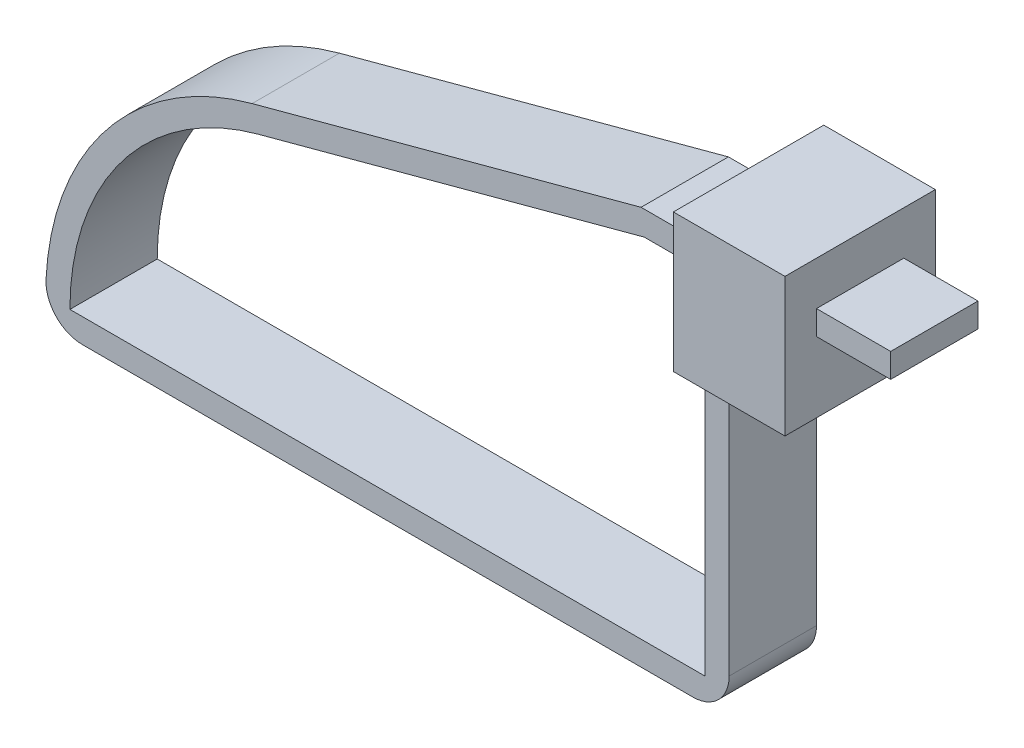
ISO-10303-21;
HEADER;
FILE_DESCRIPTION(('STEP AP214'),'2;1');
FILE_NAME('part.step','',(''),(''),'','','');
FILE_SCHEMA(('AUTOMOTIVE_DESIGN { 1 0 10303 214 1 1 1 1 }'));
ENDSEC;
DATA;
#1=APPLICATION_CONTEXT('core data for automotive mechanical design processes');
#2=APPLICATION_PROTOCOL_DEFINITION('international standard','automotive_design',2000,#1);
#3=PRODUCT_CONTEXT('',#1,'mechanical');
#4=PRODUCT('Part','Part','',(#3));
#5=PRODUCT_RELATED_PRODUCT_CATEGORY('part','',(#4));
#6=PRODUCT_DEFINITION_FORMATION('','',#4);
#7=PRODUCT_DEFINITION_CONTEXT('part definition',#1,'design');
#8=PRODUCT_DEFINITION('design','',#6,#7);
#9=PRODUCT_DEFINITION_SHAPE('','',#8);
#10=(LENGTH_UNIT() NAMED_UNIT(*) SI_UNIT(.MILLI.,.METRE.));
#11=(NAMED_UNIT(*) PLANE_ANGLE_UNIT() SI_UNIT($,.RADIAN.));
#12=(NAMED_UNIT(*) SI_UNIT($,.STERADIAN.) SOLID_ANGLE_UNIT());
#13=UNCERTAINTY_MEASURE_WITH_UNIT(LENGTH_MEASURE(1.E-05),#10,'distance_accuracy_value','');
#14=(GEOMETRIC_REPRESENTATION_CONTEXT(3) GLOBAL_UNCERTAINTY_ASSIGNED_CONTEXT((#13)) GLOBAL_UNIT_ASSIGNED_CONTEXT((#10,
#11,#12)) REPRESENTATION_CONTEXT('',''));
#15=CARTESIAN_POINT('',(0.,0.,0.));
#16=DIRECTION('',(0.,0.,1.));
#17=DIRECTION('',(1.,0.,0.));
#18=AXIS2_PLACEMENT_3D('',#15,#16,#17);
#19=CARTESIAN_POINT('',(9.72640240346712,19.5834,2.286));
#20=DIRECTION('',(-1.,0.,0.));
#21=DIRECTION('',(0.,0.,1.));
#22=AXIS2_PLACEMENT_3D('',#19,#20,#21);
#23=PLANE('',#22);
#24=DIRECTION('',(0.,0.,-1.));
#25=VECTOR('',#24,1.);
#26=CARTESIAN_POINT('',(9.72640240346712,19.5834,2.286));
#27=LINE('',#26,#25);
#28=CARTESIAN_POINT('',(9.72640240346712,19.5834,-2.286));
#29=VERTEX_POINT('',#28);
#30=CARTESIAN_POINT('',(9.72640240346712,19.5834,2.286));
#31=VERTEX_POINT('',#30);
#32=EDGE_CURVE('E218',#29,#31,#27,.F.);
#33=ORIENTED_EDGE('',*,*,#32,.T.);
#34=DIRECTION('',(0.,1.,0.));
#35=VECTOR('',#34,1.);
#36=CARTESIAN_POINT('',(9.72640240346712,0.,2.286));
#37=LINE('',#36,#35);
#38=CARTESIAN_POINT('',(9.72640240346712,18.3134,2.286));
#39=VERTEX_POINT('',#38);
#40=EDGE_CURVE('E215',#39,#31,#37,.T.);
#41=ORIENTED_EDGE('',*,*,#40,.F.);
#42=DIRECTION('',(0.,0.,1.));
#43=VECTOR('',#42,1.);
#44=CARTESIAN_POINT('',(9.72640240346712,18.3134,2.286));
#45=LINE('',#44,#43);
#46=CARTESIAN_POINT('',(9.72640240346712,18.3134,-2.286));
#47=VERTEX_POINT('',#46);
#48=EDGE_CURVE('E226',#39,#47,#45,.F.);
#49=ORIENTED_EDGE('',*,*,#48,.T.);
#50=DIRECTION('',(0.,1.,0.));
#51=VECTOR('',#50,1.);
#52=CARTESIAN_POINT('',(9.72640240346712,0.,-2.286));
#53=LINE('',#52,#51);
#54=EDGE_CURVE('E209',#47,#29,#53,.T.);
#55=ORIENTED_EDGE('',*,*,#54,.T.);
#56=EDGE_LOOP('',(#33,#41,#49,#55));
#57=FACE_BOUND('',#56,.T.);
#58=ADVANCED_FACE('F17',(#57),#23,.F.);
#59=CARTESIAN_POINT('',(0.,0.,-2.286));
#60=DIRECTION('',(0.,0.,1.));
#61=DIRECTION('',(1.,0.,0.));
#62=AXIS2_PLACEMENT_3D('',#59,#60,#61);
#63=PLANE('',#62);
#64=DIRECTION('',(0.,1.,0.));
#65=VECTOR('',#64,1.);
#66=CARTESIAN_POINT('',(5.842,0.,-2.286));
#67=LINE('',#66,#65);
#68=CARTESIAN_POINT('',(5.842,19.5834,-2.286));
#69=VERTEX_POINT('',#68);
#70=CARTESIAN_POINT('',(5.842,18.3134,-2.286));
#71=VERTEX_POINT('',#70);
#72=EDGE_CURVE('E211',#69,#71,#67,.F.);
#73=ORIENTED_EDGE('',*,*,#72,.F.);
#74=DIRECTION('',(1.,0.,0.));
#75=VECTOR('',#74,1.);
#76=CARTESIAN_POINT('',(3.08029382202642,19.5834,-2.286));
#77=LINE('',#76,#75);
#78=EDGE_CURVE('E223',#69,#29,#77,.T.);
#79=ORIENTED_EDGE('',*,*,#78,.T.);
#80=ORIENTED_EDGE('',*,*,#54,.F.);
#81=DIRECTION('',(1.,0.,0.));
#82=VECTOR('',#81,1.);
#83=CARTESIAN_POINT('',(3.08029382202642,18.3134,-2.286));
#84=LINE('',#83,#82);
#85=EDGE_CURVE('E228',#47,#71,#84,.F.);
#86=ORIENTED_EDGE('',*,*,#85,.T.);
#87=EDGE_LOOP('',(#73,#79,#80,#86));
#88=FACE_BOUND('',#87,.T.);
#89=ADVANCED_FACE('F635',(#88),#63,.F.);
#90=CARTESIAN_POINT('',(0.,0.,2.286));
#91=DIRECTION('',(0.,0.,1.));
#92=DIRECTION('',(1.,0.,0.));
#93=AXIS2_PLACEMENT_3D('',#90,#91,#92);
#94=PLANE('',#93);
#95=ORIENTED_EDGE('',*,*,#40,.T.);
#96=DIRECTION('',(1.,0.,0.));
#97=VECTOR('',#96,1.);
#98=CARTESIAN_POINT('',(3.08029382202642,19.5834,2.286));
#99=LINE('',#98,#97);
#100=CARTESIAN_POINT('',(5.842,19.5834,2.286));
#101=VERTEX_POINT('',#100);
#102=EDGE_CURVE('E220',#31,#101,#99,.F.);
#103=ORIENTED_EDGE('',*,*,#102,.T.);
#104=DIRECTION('',(0.,1.,0.));
#105=VECTOR('',#104,1.);
#106=CARTESIAN_POINT('',(5.842,0.,2.286));
#107=LINE('',#106,#105);
#108=CARTESIAN_POINT('',(5.842,18.3134,2.286));
#109=VERTEX_POINT('',#108);
#110=EDGE_CURVE('E213',#101,#109,#107,.F.);
#111=ORIENTED_EDGE('',*,*,#110,.T.);
#112=DIRECTION('',(1.,0.,0.));
#113=VECTOR('',#112,1.);
#114=CARTESIAN_POINT('',(3.08029382202642,18.3134,2.286));
#115=LINE('',#114,#113);
#116=EDGE_CURVE('E231',#109,#39,#115,.T.);
#117=ORIENTED_EDGE('',*,*,#116,.T.);
#118=EDGE_LOOP('',(#95,#103,#111,#117));
#119=FACE_BOUND('',#118,.T.);
#120=ADVANCED_FACE('F626',(#119),#94,.T.);
#121=CARTESIAN_POINT('',(3.08029382202642,19.5834,2.286));
#122=DIRECTION('',(0.,-1.,0.));
#123=DIRECTION('',(0.,0.,-1.));
#124=AXIS2_PLACEMENT_3D('',#121,#122,#123);
#125=PLANE('',#124);
#126=DIRECTION('',(0.,0.,1.));
#127=VECTOR('',#126,1.);
#128=CARTESIAN_POINT('',(5.842,19.5834,3.937));
#129=LINE('',#128,#127);
#130=EDGE_CURVE('E234',#69,#101,#129,.T.);
#131=ORIENTED_EDGE('',*,*,#130,.T.);
#132=ORIENTED_EDGE('',*,*,#102,.F.);
#133=ORIENTED_EDGE('',*,*,#32,.F.);
#134=ORIENTED_EDGE('',*,*,#78,.F.);
#135=EDGE_LOOP('',(#131,#132,#133,#134));
#136=FACE_BOUND('',#135,.T.);
#137=ADVANCED_FACE('F617',(#136),#125,.F.);
#138=CARTESIAN_POINT('',(3.08029382202642,18.3134,2.286));
#139=DIRECTION('',(0.,1.,0.));
#140=DIRECTION('',(0.,0.,1.));
#141=AXIS2_PLACEMENT_3D('',#138,#139,#140);
#142=PLANE('',#141);
#143=DIRECTION('',(0.,0.,1.));
#144=VECTOR('',#143,1.);
#145=CARTESIAN_POINT('',(5.842,18.3134,3.937));
#146=LINE('',#145,#144);
#147=EDGE_CURVE('E270',#109,#71,#146,.F.);
#148=ORIENTED_EDGE('',*,*,#147,.T.);
#149=ORIENTED_EDGE('',*,*,#85,.F.);
#150=ORIENTED_EDGE('',*,*,#48,.F.);
#151=ORIENTED_EDGE('',*,*,#116,.F.);
#152=EDGE_LOOP('',(#148,#149,#150,#151));
#153=FACE_BOUND('',#152,.T.);
#154=ADVANCED_FACE('F609',(#153),#142,.F.);
#155=CARTESIAN_POINT('',(5.842,14.6304,3.937));
#156=DIRECTION('',(-1.,0.,0.));
#157=DIRECTION('',(0.,0.,1.));
#158=AXIS2_PLACEMENT_3D('',#155,#156,#157);
#159=PLANE('',#158);
#160=DIRECTION('',(0.,0.,-1.));
#161=VECTOR('',#160,1.);
#162=CARTESIAN_POINT('',(5.842,21.8694,3.937));
#163=LINE('',#162,#161);
#164=CARTESIAN_POINT('',(5.842,21.8694,-3.937));
#165=VERTEX_POINT('',#164);
#166=CARTESIAN_POINT('',(5.842,21.8694,3.937));
#167=VERTEX_POINT('',#166);
#168=EDGE_CURVE('E246',#165,#167,#163,.F.);
#169=ORIENTED_EDGE('',*,*,#168,.T.);
#170=DIRECTION('',(0.,1.,0.));
#171=VECTOR('',#170,1.);
#172=CARTESIAN_POINT('',(5.842,0.,3.937));
#173=LINE('',#172,#171);
#174=CARTESIAN_POINT('',(5.842,14.6304,3.937));
#175=VERTEX_POINT('',#174);
#176=EDGE_CURVE('E247',#167,#175,#173,.F.);
#177=ORIENTED_EDGE('',*,*,#176,.T.);
#178=DIRECTION('',(0.,0.,1.));
#179=VECTOR('',#178,1.);
#180=CARTESIAN_POINT('',(5.842,14.6304,3.937));
#181=LINE('',#180,#179);
#182=CARTESIAN_POINT('',(5.842,14.6304,-3.937));
#183=VERTEX_POINT('',#182);
#184=EDGE_CURVE('E265',#175,#183,#181,.F.);
#185=ORIENTED_EDGE('',*,*,#184,.T.);
#186=DIRECTION('',(0.,1.,0.));
#187=VECTOR('',#186,1.);
#188=CARTESIAN_POINT('',(5.842,0.,-3.937));
#189=LINE('',#188,#187);
#190=EDGE_CURVE('E259',#165,#183,#189,.F.);
#191=ORIENTED_EDGE('',*,*,#190,.F.);
#192=EDGE_LOOP('',(#169,#177,#185,#191));
#193=FACE_BOUND('',#192,.T.);
#194=ORIENTED_EDGE('',*,*,#110,.F.);
#195=ORIENTED_EDGE('',*,*,#130,.F.);
#196=ORIENTED_EDGE('',*,*,#72,.T.);
#197=ORIENTED_EDGE('',*,*,#147,.F.);
#198=EDGE_LOOP('',(#194,#195,#196,#197));
#199=FACE_BOUND('',#198,.T.);
#200=ADVANCED_FACE('F423',(#193,#199),#159,.F.);
#201=CARTESIAN_POINT('',(0.,14.6304,3.937));
#202=DIRECTION('',(0.,1.,0.));
#203=DIRECTION('',(0.,0.,1.));
#204=AXIS2_PLACEMENT_3D('',#201,#202,#203);
#205=PLANE('',#204);
#206=DIRECTION('',(0.,0.,1.));
#207=VECTOR('',#206,1.);
#208=CARTESIAN_POINT('',(1.27,14.6304,2.286));
#209=LINE('',#208,#207);
#210=CARTESIAN_POINT('',(1.27,14.6304,2.286));
#211=VERTEX_POINT('',#210);
#212=CARTESIAN_POINT('',(1.27,14.6304,-2.286));
#213=VERTEX_POINT('',#212);
#214=EDGE_CURVE('E290',#211,#213,#209,.F.);
#215=ORIENTED_EDGE('',*,*,#214,.T.);
#216=DIRECTION('',(1.,0.,0.));
#217=VECTOR('',#216,1.);
#218=CARTESIAN_POINT('',(0.,14.6304,-2.286));
#219=LINE('',#218,#217);
#220=CARTESIAN_POINT('',(0.,14.6304,-2.286));
#221=VERTEX_POINT('',#220);
#222=EDGE_CURVE('E264',#221,#213,#219,.T.);
#223=ORIENTED_EDGE('',*,*,#222,.F.);
#224=DIRECTION('',(0.,0.,1.));
#225=VECTOR('',#224,1.);
#226=CARTESIAN_POINT('',(0.,14.6304,3.937));
#227=LINE('',#226,#225);
#228=CARTESIAN_POINT('',(0.,14.6304,-3.937));
#229=VERTEX_POINT('',#228);
#230=EDGE_CURVE('E262',#229,#221,#227,.T.);
#231=ORIENTED_EDGE('',*,*,#230,.F.);
#232=DIRECTION('',(-1.,0.,0.));
#233=VECTOR('',#232,1.);
#234=CARTESIAN_POINT('',(0.,14.6304,-3.937));
#235=LINE('',#234,#233);
#236=EDGE_CURVE('E256',#183,#229,#235,.T.);
#237=ORIENTED_EDGE('',*,*,#236,.F.);
#238=ORIENTED_EDGE('',*,*,#184,.F.);
#239=DIRECTION('',(-1.,0.,0.));
#240=VECTOR('',#239,1.);
#241=CARTESIAN_POINT('',(0.,14.6304,3.937));
#242=LINE('',#241,#240);
#243=CARTESIAN_POINT('',(0.,14.6304,3.937));
#244=VERTEX_POINT('',#243);
#245=EDGE_CURVE('E243',#175,#244,#242,.T.);
#246=ORIENTED_EDGE('',*,*,#245,.T.);
#247=DIRECTION('',(0.,0.,1.));
#248=VECTOR('',#247,1.);
#249=CARTESIAN_POINT('',(0.,14.6304,3.937));
#250=LINE('',#249,#248);
#251=CARTESIAN_POINT('',(0.,14.6304,2.286));
#252=VERTEX_POINT('',#251);
#253=EDGE_CURVE('E268',#252,#244,#250,.T.);
#254=ORIENTED_EDGE('',*,*,#253,.F.);
#255=DIRECTION('',(1.,0.,0.));
#256=VECTOR('',#255,1.);
#257=CARTESIAN_POINT('',(0.,14.6304,2.286));
#258=LINE('',#257,#256);
#259=EDGE_CURVE('E274',#211,#252,#258,.F.);
#260=ORIENTED_EDGE('',*,*,#259,.F.);
#261=EDGE_LOOP('',(#215,#223,#231,#237,#238,#246,#254,#260));
#262=FACE_BOUND('',#261,.T.);
#263=ADVANCED_FACE('F428',(#262),#205,.F.);
#264=CARTESIAN_POINT('',(-0.635,19.5834,2.286));
#265=DIRECTION('',(0.,-1.,0.));
#266=DIRECTION('',(1.,0.,0.));
#267=AXIS2_PLACEMENT_3D('',#264,#265,#266);
#268=PLANE('',#267);
#269=DIRECTION('',(0.,0.,1.));
#270=VECTOR('',#269,1.);
#271=CARTESIAN_POINT('',(-3.34288186403865,19.5834,2.286));
#272=LINE('',#271,#270);
#273=CARTESIAN_POINT('',(-3.34288186403864,19.5834,-2.286));
#274=VERTEX_POINT('',#273);
#275=CARTESIAN_POINT('',(-3.34288186403864,19.5834,2.286));
#276=VERTEX_POINT('',#275);
#277=EDGE_CURVE('E177',#274,#276,#272,.T.);
#278=ORIENTED_EDGE('',*,*,#277,.T.);
#279=DIRECTION('',(1.,0.,0.));
#280=VECTOR('',#279,1.);
#281=CARTESIAN_POINT('',(-19.9136,19.5834,2.286));
#282=LINE('',#281,#280);
#283=CARTESIAN_POINT('',(-0.635,19.5834,2.286));
#284=VERTEX_POINT('',#283);
#285=EDGE_CURVE('E195',#284,#276,#282,.F.);
#286=ORIENTED_EDGE('',*,*,#285,.F.);
#287=DIRECTION('',(0.,0.,-1.));
#288=VECTOR('',#287,1.);
#289=CARTESIAN_POINT('',(-0.635,19.5834,2.286));
#290=LINE('',#289,#288);
#291=CARTESIAN_POINT('',(-0.635,19.5834,-2.286));
#292=VERTEX_POINT('',#291);
#293=EDGE_CURVE('E289',#292,#284,#290,.F.);
#294=ORIENTED_EDGE('',*,*,#293,.F.);
#295=DIRECTION('',(1.,0.,0.));
#296=VECTOR('',#295,1.);
#297=CARTESIAN_POINT('',(-19.9136,19.5834,-2.286));
#298=LINE('',#297,#296);
#299=EDGE_CURVE('E182',#292,#274,#298,.F.);
#300=ORIENTED_EDGE('',*,*,#299,.T.);
#301=EDGE_LOOP('',(#278,#286,#294,#300));
#302=FACE_BOUND('',#301,.T.);
#303=ADVANCED_FACE('F585',(#302),#268,.F.);
#304=CARTESIAN_POINT('',(-3.34288186403865,19.5834,2.286));
#305=DIRECTION('',(0.259840356397533,-0.965651587886233,0.));
#306=DIRECTION('',(0.965651587886233,0.259840356397533,0.));
#307=AXIS2_PLACEMENT_3D('',#304,#305,#306);
#308=PLANE('',#307);
#309=DIRECTION('',(0.,0.,-1.));
#310=VECTOR('',#309,1.);
#311=CARTESIAN_POINT('',(-23.708568405186,14.1033414410784,2.286));
#312=LINE('',#311,#310);
#313=CARTESIAN_POINT('',(-23.708568405186,14.1033414410784,2.286));
#314=VERTEX_POINT('',#313);
#315=CARTESIAN_POINT('',(-23.708568405186,14.1033414410784,-2.286));
#316=VERTEX_POINT('',#315);
#317=EDGE_CURVE('E176',#314,#316,#312,.T.);
#318=ORIENTED_EDGE('',*,*,#317,.F.);
#319=DIRECTION('',(-0.965651587886233,-0.259840356397533,0.));
#320=VECTOR('',#319,1.);
#321=CARTESIAN_POINT('',(-3.34288186403865,19.5834,2.286));
#322=LINE('',#321,#320);
#323=EDGE_CURVE('E198',#276,#314,#322,.T.);
#324=ORIENTED_EDGE('',*,*,#323,.F.);
#325=ORIENTED_EDGE('',*,*,#277,.F.);
#326=DIRECTION('',(-0.965651587886233,-0.259840356397533,0.));
#327=VECTOR('',#326,1.);
#328=CARTESIAN_POINT('',(-3.34288186403865,19.5834,-2.286));
#329=LINE('',#328,#327);
#330=EDGE_CURVE('E181',#274,#316,#329,.T.);
#331=ORIENTED_EDGE('',*,*,#330,.T.);
#332=EDGE_LOOP('',(#318,#324,#325,#331));
#333=FACE_BOUND('',#332,.T.);
#334=ADVANCED_FACE('F577',(#333),#308,.F.);
#335=CARTESIAN_POINT('',(-19.9136,0.,2.286));
#336=DIRECTION('',(0.,0.,-1.));
#337=DIRECTION('',(-1.,0.,0.));
#338=AXIS2_PLACEMENT_3D('',#335,#336,#337);
#339=CYLINDRICAL_SURFACE('',#338,14.605);
#340=CARTESIAN_POINT('',(-19.9136,0.,2.286));
#341=DIRECTION('',(0.,0.,-1.));
#342=DIRECTION('',(-1.,0.,0.));
#343=AXIS2_PLACEMENT_3D('',#340,#341,#342);
#344=CIRCLE('',#343,14.605);
#345=CARTESIAN_POINT('',(-34.5003323255587,0.730249999999995,2.286));
#346=VERTEX_POINT('',#345);
#347=EDGE_CURVE('E196',#314,#346,#344,.F.);
#348=ORIENTED_EDGE('',*,*,#347,.F.);
#349=ORIENTED_EDGE('',*,*,#317,.T.);
#350=CARTESIAN_POINT('',(-19.9136,0.,-2.286));
#351=DIRECTION('',(0.,0.,-1.));
#352=DIRECTION('',(-1.,0.,0.));
#353=AXIS2_PLACEMENT_3D('',#350,#351,#352);
#354=CIRCLE('',#353,14.605);
#355=CARTESIAN_POINT('',(-34.5003323255587,0.730249999999995,-2.286));
#356=VERTEX_POINT('',#355);
#357=EDGE_CURVE('E161',#316,#356,#354,.F.);
#358=ORIENTED_EDGE('',*,*,#357,.T.);
#359=DIRECTION('',(0.,0.,-1.));
#360=VECTOR('',#359,1.);
#361=CARTESIAN_POINT('',(-34.5003323255587,0.730249999999996,2.286));
#362=LINE('',#361,#360);
#363=EDGE_CURVE('E169',#356,#346,#362,.F.);
#364=ORIENTED_EDGE('',*,*,#363,.T.);
#365=EDGE_LOOP('',(#348,#349,#358,#364));
#366=FACE_BOUND('',#365,.T.);
#367=ADVANCED_FACE('F180',(#366),#339,.T.);
#368=CARTESIAN_POINT('',(-32.5977150657032,0.634999999999995,2.286));
#369=DIRECTION('',(0.,0.,-1.));
#370=DIRECTION('',(-1.,0.,0.));
#371=AXIS2_PLACEMENT_3D('',#368,#369,#370);
#372=CYLINDRICAL_SURFACE('',#371,1.905);
#373=CARTESIAN_POINT('',(-32.5977150657032,0.634999999999995,-2.286));
#374=DIRECTION('',(0.,0.,-1.));
#375=DIRECTION('',(-1.,0.,0.));
#376=AXIS2_PLACEMENT_3D('',#373,#374,#375);
#377=CIRCLE('',#376,1.905);
#378=CARTESIAN_POINT('',(-32.5977150657032,-1.27,-2.286));
#379=VERTEX_POINT('',#378);
#380=EDGE_CURVE('E155',#356,#379,#377,.F.);
#381=ORIENTED_EDGE('',*,*,#380,.T.);
#382=DIRECTION('',(0.,0.,1.));
#383=VECTOR('',#382,1.);
#384=CARTESIAN_POINT('',(-32.5977150657032,-1.27,2.286));
#385=LINE('',#384,#383);
#386=CARTESIAN_POINT('',(-32.5977150657032,-1.27,2.286));
#387=VERTEX_POINT('',#386);
#388=EDGE_CURVE('E295',#379,#387,#385,.T.);
#389=ORIENTED_EDGE('',*,*,#388,.T.);
#390=CARTESIAN_POINT('',(-32.5977150657032,0.634999999999995,2.286));
#391=DIRECTION('',(0.,0.,-1.));
#392=DIRECTION('',(-1.,0.,0.));
#393=AXIS2_PLACEMENT_3D('',#390,#391,#392);
#394=CIRCLE('',#393,1.905);
#395=EDGE_CURVE('E172',#346,#387,#394,.F.);
#396=ORIENTED_EDGE('',*,*,#395,.F.);
#397=ORIENTED_EDGE('',*,*,#363,.F.);
#398=EDGE_LOOP('',(#381,#389,#396,#397));
#399=FACE_BOUND('',#398,.T.);
#400=ADVANCED_FACE('F170',(#399),#372,.T.);
#401=CARTESIAN_POINT('',(-0.635,-1.27,2.286));
#402=DIRECTION('',(0.,1.,0.));
#403=DIRECTION('',(-1.,0.,0.));
#404=AXIS2_PLACEMENT_3D('',#401,#402,#403);
#405=PLANE('',#404);
#406=DIRECTION('',(0.,0.,-1.));
#407=VECTOR('',#406,1.);
#408=CARTESIAN_POINT('',(-0.634999999999999,-1.27,2.286));
#409=LINE('',#408,#407);
#410=CARTESIAN_POINT('',(-0.635,-1.27,2.286));
#411=VERTEX_POINT('',#410);
#412=CARTESIAN_POINT('',(-0.635,-1.27,-2.286));
#413=VERTEX_POINT('',#412);
#414=EDGE_CURVE('E298',#411,#413,#409,.T.);
#415=ORIENTED_EDGE('',*,*,#414,.F.);
#416=DIRECTION('',(1.,0.,0.));
#417=VECTOR('',#416,1.);
#418=CARTESIAN_POINT('',(-19.9136,-1.27,2.286));
#419=LINE('',#418,#417);
#420=EDGE_CURVE('E200',#387,#411,#419,.T.);
#421=ORIENTED_EDGE('',*,*,#420,.F.);
#422=ORIENTED_EDGE('',*,*,#388,.F.);
#423=DIRECTION('',(1.,0.,0.));
#424=VECTOR('',#423,1.);
#425=CARTESIAN_POINT('',(-19.9136,-1.27,-2.286));
#426=LINE('',#425,#424);
#427=EDGE_CURVE('E163',#379,#413,#426,.T.);
#428=ORIENTED_EDGE('',*,*,#427,.T.);
#429=EDGE_LOOP('',(#415,#421,#422,#428));
#430=FACE_BOUND('',#429,.T.);
#431=ADVANCED_FACE('F553',(#430),#405,.F.);
#432=CARTESIAN_POINT('',(-0.635,0.635,2.286));
#433=DIRECTION('',(0.,0.,-1.));
#434=DIRECTION('',(-1.,0.,0.));
#435=AXIS2_PLACEMENT_3D('',#432,#433,#434);
#436=CYLINDRICAL_SURFACE('',#435,1.905);
#437=CARTESIAN_POINT('',(-0.635,0.635,2.286));
#438=DIRECTION('',(0.,0.,-1.));
#439=DIRECTION('',(-1.,0.,0.));
#440=AXIS2_PLACEMENT_3D('',#437,#438,#439);
#441=CIRCLE('',#440,1.905);
#442=CARTESIAN_POINT('',(1.27,0.635,2.286));
#443=VERTEX_POINT('',#442);
#444=EDGE_CURVE('E201',#411,#443,#441,.F.);
#445=ORIENTED_EDGE('',*,*,#444,.F.);
#446=ORIENTED_EDGE('',*,*,#414,.T.);
#447=CARTESIAN_POINT('',(-0.635,0.635,-2.286));
#448=DIRECTION('',(0.,0.,-1.));
#449=DIRECTION('',(-1.,0.,0.));
#450=AXIS2_PLACEMENT_3D('',#447,#448,#449);
#451=CIRCLE('',#450,1.905);
#452=CARTESIAN_POINT('',(1.27,0.635,-2.286));
#453=VERTEX_POINT('',#452);
#454=EDGE_CURVE('E185',#413,#453,#451,.F.);
#455=ORIENTED_EDGE('',*,*,#454,.T.);
#456=DIRECTION('',(0.,0.,1.));
#457=VECTOR('',#456,1.);
#458=CARTESIAN_POINT('',(1.27,0.635,2.286));
#459=LINE('',#458,#457);
#460=EDGE_CURVE('E301',#453,#443,#459,.T.);
#461=ORIENTED_EDGE('',*,*,#460,.T.);
#462=EDGE_LOOP('',(#445,#446,#455,#461));
#463=FACE_BOUND('',#462,.T.);
#464=ADVANCED_FACE('F544',(#463),#436,.T.);
#465=CARTESIAN_POINT('',(1.27,0.635,2.286));
#466=DIRECTION('',(-1.,0.,0.));
#467=DIRECTION('',(0.,0.,1.));
#468=AXIS2_PLACEMENT_3D('',#465,#466,#467);
#469=PLANE('',#468);
#470=DIRECTION('',(0.,1.,0.));
#471=VECTOR('',#470,1.);
#472=CARTESIAN_POINT('',(1.27,0.,2.286));
#473=LINE('',#472,#471);
#474=EDGE_CURVE('E204',#443,#211,#473,.T.);
#475=ORIENTED_EDGE('',*,*,#474,.F.);
#476=ORIENTED_EDGE('',*,*,#460,.F.);
#477=DIRECTION('',(0.,1.,0.));
#478=VECTOR('',#477,1.);
#479=CARTESIAN_POINT('',(1.27,0.,-2.286));
#480=LINE('',#479,#478);
#481=EDGE_CURVE('E187',#453,#213,#480,.T.);
#482=ORIENTED_EDGE('',*,*,#481,.T.);
#483=ORIENTED_EDGE('',*,*,#214,.F.);
#484=EDGE_LOOP('',(#475,#476,#482,#483));
#485=FACE_BOUND('',#484,.T.);
#486=ADVANCED_FACE('F535',(#485),#469,.F.);
#487=CARTESIAN_POINT('',(-3.175,18.3134,2.286));
#488=DIRECTION('',(0.259840356397533,-0.965651587886233,0.));
#489=DIRECTION('',(0.965651587886233,0.259840356397533,0.));
#490=AXIS2_PLACEMENT_3D('',#487,#488,#489);
#491=PLANE('',#490);
#492=DIRECTION('',(0.965651587886233,0.259840356397533,0.));
#493=VECTOR('',#492,1.);
#494=CARTESIAN_POINT('',(-23.3785711525611,12.8769639244629,2.286));
#495=LINE('',#494,#493);
#496=CARTESIAN_POINT('',(-23.3785711525611,12.8769639244629,2.286));
#497=VERTEX_POINT('',#496);
#498=CARTESIAN_POINT('',(-3.175,18.3134,2.286));
#499=VERTEX_POINT('',#498);
#500=EDGE_CURVE('E208',#497,#499,#495,.T.);
#501=ORIENTED_EDGE('',*,*,#500,.F.);
#502=DIRECTION('',(0.,0.,-1.));
#503=VECTOR('',#502,1.);
#504=CARTESIAN_POINT('',(-23.3785711525611,12.8769639244629,2.286));
#505=LINE('',#504,#503);
#506=CARTESIAN_POINT('',(-23.3785711525611,12.8769639244629,-2.286));
#507=VERTEX_POINT('',#506);
#508=EDGE_CURVE('E191',#497,#507,#505,.T.);
#509=ORIENTED_EDGE('',*,*,#508,.T.);
#510=DIRECTION('',(0.965651587886233,0.259840356397533,0.));
#511=VECTOR('',#510,1.);
#512=CARTESIAN_POINT('',(-23.3785711525611,12.8769639244629,-2.286));
#513=LINE('',#512,#511);
#514=CARTESIAN_POINT('',(-3.175,18.3134,-2.286));
#515=VERTEX_POINT('',#514);
#516=EDGE_CURVE('E326',#507,#515,#513,.T.);
#517=ORIENTED_EDGE('',*,*,#516,.T.);
#518=DIRECTION('',(0.,0.,-1.));
#519=VECTOR('',#518,1.);
#520=CARTESIAN_POINT('',(-3.175,18.3134,2.286));
#521=LINE('',#520,#519);
#522=EDGE_CURVE('E286',#499,#515,#521,.T.);
#523=ORIENTED_EDGE('',*,*,#522,.F.);
#524=EDGE_LOOP('',(#501,#509,#517,#523));
#525=FACE_BOUND('',#524,.T.);
#526=ADVANCED_FACE('F526',(#525),#491,.T.);
#527=CARTESIAN_POINT('',(0.,18.3134,2.286));
#528=DIRECTION('',(0.,-1.,0.));
#529=DIRECTION('',(0.,0.,-1.));
#530=AXIS2_PLACEMENT_3D('',#527,#528,#529);
#531=PLANE('',#530);
#532=DIRECTION('',(1.,0.,0.));
#533=VECTOR('',#532,1.);
#534=CARTESIAN_POINT('',(-19.9136,18.3134,2.286));
#535=LINE('',#534,#533);
#536=CARTESIAN_POINT('',(0.,18.3134,2.286));
#537=VERTEX_POINT('',#536);
#538=EDGE_CURVE('E190',#499,#537,#535,.T.);
#539=ORIENTED_EDGE('',*,*,#538,.F.);
#540=ORIENTED_EDGE('',*,*,#522,.T.);
#541=DIRECTION('',(1.,0.,0.));
#542=VECTOR('',#541,1.);
#543=CARTESIAN_POINT('',(-19.9136,18.3134,-2.286));
#544=LINE('',#543,#542);
#545=CARTESIAN_POINT('',(0.,18.3134,-2.286));
#546=VERTEX_POINT('',#545);
#547=EDGE_CURVE('E308',#515,#546,#544,.T.);
#548=ORIENTED_EDGE('',*,*,#547,.T.);
#549=DIRECTION('',(0.,0.,1.));
#550=VECTOR('',#549,1.);
#551=CARTESIAN_POINT('',(0.,18.3134,2.286));
#552=LINE('',#551,#550);
#553=EDGE_CURVE('E317',#537,#546,#552,.F.);
#554=ORIENTED_EDGE('',*,*,#553,.F.);
#555=EDGE_LOOP('',(#539,#540,#548,#554));
#556=FACE_BOUND('',#555,.T.);
#557=ADVANCED_FACE('F441',(#556),#531,.T.);
#558=CARTESIAN_POINT('',(-0.635,17.6784,2.286));
#559=DIRECTION('',(0.,0.,-1.));
#560=DIRECTION('',(-1.,0.,0.));
#561=AXIS2_PLACEMENT_3D('',#558,#559,#560);
#562=CYLINDRICAL_SURFACE('',#561,1.905);
#563=ORIENTED_EDGE('',*,*,#293,.T.);
#564=CARTESIAN_POINT('',(-0.635,17.6784,2.286));
#565=DIRECTION('',(0.,0.,-1.));
#566=DIRECTION('',(-1.,0.,0.));
#567=AXIS2_PLACEMENT_3D('',#564,#565,#566);
#568=CIRCLE('',#567,1.905);
#569=CARTESIAN_POINT('',(0.,19.4744512242138,2.286));
#570=VERTEX_POINT('',#569);
#571=EDGE_CURVE('E192',#570,#284,#568,.F.);
#572=ORIENTED_EDGE('',*,*,#571,.F.);
#573=DIRECTION('',(0.,0.,1.));
#574=VECTOR('',#573,1.);
#575=CARTESIAN_POINT('',(0.,19.4744512242138,2.286));
#576=LINE('',#575,#574);
#577=CARTESIAN_POINT('',(0.,19.4744512242138,-2.286));
#578=VERTEX_POINT('',#577);
#579=EDGE_CURVE('E331',#578,#570,#576,.T.);
#580=ORIENTED_EDGE('',*,*,#579,.F.);
#581=CARTESIAN_POINT('',(-0.635,17.6784,-2.286));
#582=DIRECTION('',(0.,0.,-1.));
#583=DIRECTION('',(-1.,0.,0.));
#584=AXIS2_PLACEMENT_3D('',#581,#582,#583);
#585=CIRCLE('',#584,1.905);
#586=EDGE_CURVE('E20',#578,#292,#585,.F.);
#587=ORIENTED_EDGE('',*,*,#586,.T.);
#588=EDGE_LOOP('',(#563,#572,#580,#587));
#589=FACE_BOUND('',#588,.T.);
#590=ADVANCED_FACE('F432',(#589),#562,.T.);
#591=CARTESIAN_POINT('',(0.,0.,3.937));
#592=DIRECTION('',(0.,0.,-1.));
#593=DIRECTION('',(-1.,0.,0.));
#594=AXIS2_PLACEMENT_3D('',#591,#592,#593);
#595=PLANE('',#594);
#596=ORIENTED_EDGE('',*,*,#245,.F.);
#597=ORIENTED_EDGE('',*,*,#176,.F.);
#598=DIRECTION('',(1.,0.,0.));
#599=VECTOR('',#598,1.);
#600=CARTESIAN_POINT('',(0.,21.8694,3.937));
#601=LINE('',#600,#599);
#602=CARTESIAN_POINT('',(0.,21.8694,3.937));
#603=VERTEX_POINT('',#602);
#604=EDGE_CURVE('E338',#167,#603,#601,.F.);
#605=ORIENTED_EDGE('',*,*,#604,.T.);
#606=DIRECTION('',(0.,1.,0.));
#607=VECTOR('',#606,1.);
#608=CARTESIAN_POINT('',(0.,0.,3.937));
#609=LINE('',#608,#607);
#610=EDGE_CURVE('E237',#244,#603,#609,.T.);
#611=ORIENTED_EDGE('',*,*,#610,.F.);
#612=EDGE_LOOP('',(#596,#597,#605,#611));
#613=FACE_BOUND('',#612,.T.);
#614=ADVANCED_FACE('F430',(#613),#595,.F.);
#615=CARTESIAN_POINT('',(0.,21.8694,3.937));
#616=DIRECTION('',(0.,-1.,0.));
#617=DIRECTION('',(0.,0.,-1.));
#618=AXIS2_PLACEMENT_3D('',#615,#616,#617);
#619=PLANE('',#618);
#620=DIRECTION('',(0.,0.,1.));
#621=VECTOR('',#620,1.);
#622=CARTESIAN_POINT('',(0.,21.8694,2.286));
#623=LINE('',#622,#621);
#624=CARTESIAN_POINT('',(0.,21.8694,-3.937));
#625=VERTEX_POINT('',#624);
#626=EDGE_CURVE('E240',#603,#625,#623,.F.);
#627=ORIENTED_EDGE('',*,*,#626,.F.);
#628=ORIENTED_EDGE('',*,*,#604,.F.);
#629=ORIENTED_EDGE('',*,*,#168,.F.);
#630=DIRECTION('',(-1.,0.,0.));
#631=VECTOR('',#630,1.);
#632=CARTESIAN_POINT('',(0.,21.8694,-3.937));
#633=LINE('',#632,#631);
#634=EDGE_CURVE('E341',#625,#165,#633,.F.);
#635=ORIENTED_EDGE('',*,*,#634,.F.);
#636=EDGE_LOOP('',(#627,#628,#629,#635));
#637=FACE_BOUND('',#636,.T.);
#638=ADVANCED_FACE('F409',(#637),#619,.F.);
#639=CARTESIAN_POINT('',(0.,0.,-3.937));
#640=DIRECTION('',(0.,0.,-1.));
#641=DIRECTION('',(-1.,0.,0.));
#642=AXIS2_PLACEMENT_3D('',#639,#640,#641);
#643=PLANE('',#642);
#644=ORIENTED_EDGE('',*,*,#190,.T.);
#645=ORIENTED_EDGE('',*,*,#236,.T.);
#646=DIRECTION('',(0.,1.,0.));
#647=VECTOR('',#646,1.);
#648=CARTESIAN_POINT('',(0.,0.,-3.937));
#649=LINE('',#648,#647);
#650=EDGE_CURVE('E250',#625,#229,#649,.F.);
#651=ORIENTED_EDGE('',*,*,#650,.F.);
#652=ORIENTED_EDGE('',*,*,#634,.T.);
#653=EDGE_LOOP('',(#644,#645,#651,#652));
#654=FACE_BOUND('',#653,.T.);
#655=ADVANCED_FACE('F439',(#654),#643,.T.);
#656=CARTESIAN_POINT('',(-19.9136,0.,-2.286));
#657=DIRECTION('',(0.,0.,1.));
#658=DIRECTION('',(1.,0.,0.));
#659=AXIS2_PLACEMENT_3D('',#656,#657,#658);
#660=PLANE('',#659);
#661=ORIENTED_EDGE('',*,*,#547,.F.);
#662=ORIENTED_EDGE('',*,*,#516,.F.);
#663=CARTESIAN_POINT('',(-19.9136,0.,-2.286));
#664=DIRECTION('',(0.,0.,-1.));
#665=DIRECTION('',(-1.,0.,0.));
#666=AXIS2_PLACEMENT_3D('',#663,#664,#665);
#667=CIRCLE('',#666,13.335);
#668=CARTESIAN_POINT('',(-33.2486,0.,-2.286));
#669=VERTEX_POINT('',#668);
#670=EDGE_CURVE('E188',#507,#669,#667,.F.);
#671=ORIENTED_EDGE('',*,*,#670,.T.);
#672=DIRECTION('',(-1.,0.,0.));
#673=VECTOR('',#672,1.);
#674=CARTESIAN_POINT('',(0.,0.,-2.286));
#675=LINE('',#674,#673);
#676=CARTESIAN_POINT('',(0.,0.,-2.286));
#677=VERTEX_POINT('',#676);
#678=EDGE_CURVE('E350',#677,#669,#675,.T.);
#679=ORIENTED_EDGE('',*,*,#678,.F.);
#680=DIRECTION('',(0.,1.,0.));
#681=VECTOR('',#680,1.);
#682=CARTESIAN_POINT('',(0.,0.,-2.286));
#683=LINE('',#682,#681);
#684=EDGE_CURVE('E253',#221,#677,#683,.F.);
#685=ORIENTED_EDGE('',*,*,#684,.F.);
#686=ORIENTED_EDGE('',*,*,#222,.T.);
#687=ORIENTED_EDGE('',*,*,#481,.F.);
#688=ORIENTED_EDGE('',*,*,#454,.F.);
#689=ORIENTED_EDGE('',*,*,#427,.F.);
#690=ORIENTED_EDGE('',*,*,#380,.F.);
#691=ORIENTED_EDGE('',*,*,#357,.F.);
#692=ORIENTED_EDGE('',*,*,#330,.F.);
#693=ORIENTED_EDGE('',*,*,#299,.F.);
#694=ORIENTED_EDGE('',*,*,#586,.F.);
#695=DIRECTION('',(0.,1.,0.));
#696=VECTOR('',#695,1.);
#697=CARTESIAN_POINT('',(0.,0.,-2.286));
#698=LINE('',#697,#696);
#699=EDGE_CURVE('E322',#546,#578,#698,.T.);
#700=ORIENTED_EDGE('',*,*,#699,.F.);
#701=EDGE_LOOP('',(#661,#662,#671,#679,#685,#686,#687,#688,#689,#690,#691,#692,#693,#694,#700));
#702=FACE_BOUND('',#701,.T.);
#703=ADVANCED_FACE('F158',(#702),#660,.F.);
#704=CARTESIAN_POINT('',(-19.9136,0.,2.286));
#705=DIRECTION('',(0.,0.,-1.));
#706=DIRECTION('',(-1.,0.,0.));
#707=AXIS2_PLACEMENT_3D('',#704,#705,#706);
#708=CYLINDRICAL_SURFACE('',#707,13.335);
#709=ORIENTED_EDGE('',*,*,#508,.F.);
#710=CARTESIAN_POINT('',(-19.9136,0.,2.286));
#711=DIRECTION('',(0.,0.,-1.));
#712=DIRECTION('',(-1.,0.,0.));
#713=AXIS2_PLACEMENT_3D('',#710,#711,#712);
#714=CIRCLE('',#713,13.335);
#715=CARTESIAN_POINT('',(-33.2486,0.,2.286));
#716=VERTEX_POINT('',#715);
#717=EDGE_CURVE('E205',#716,#497,#714,.T.);
#718=ORIENTED_EDGE('',*,*,#717,.F.);
#719=DIRECTION('',(0.,0.,1.));
#720=VECTOR('',#719,1.);
#721=CARTESIAN_POINT('',(-33.2486,0.,2.286));
#722=LINE('',#721,#720);
#723=EDGE_CURVE('E368',#669,#716,#722,.T.);
#724=ORIENTED_EDGE('',*,*,#723,.F.);
#725=ORIENTED_EDGE('',*,*,#670,.F.);
#726=EDGE_LOOP('',(#709,#718,#724,#725));
#727=FACE_BOUND('',#726,.T.);
#728=ADVANCED_FACE('F456',(#727),#708,.F.);
#729=CARTESIAN_POINT('',(-19.9136,0.,2.286));
#730=DIRECTION('',(0.,0.,1.));
#731=DIRECTION('',(1.,0.,0.));
#732=AXIS2_PLACEMENT_3D('',#729,#730,#731);
#733=PLANE('',#732);
#734=ORIENTED_EDGE('',*,*,#717,.T.);
#735=ORIENTED_EDGE('',*,*,#500,.T.);
#736=ORIENTED_EDGE('',*,*,#538,.T.);
#737=DIRECTION('',(0.,1.,0.));
#738=VECTOR('',#737,1.);
#739=CARTESIAN_POINT('',(0.,0.,2.286));
#740=LINE('',#739,#738);
#741=EDGE_CURVE('E314',#570,#537,#740,.F.);
#742=ORIENTED_EDGE('',*,*,#741,.F.);
#743=ORIENTED_EDGE('',*,*,#571,.T.);
#744=ORIENTED_EDGE('',*,*,#285,.T.);
#745=ORIENTED_EDGE('',*,*,#323,.T.);
#746=ORIENTED_EDGE('',*,*,#347,.T.);
#747=ORIENTED_EDGE('',*,*,#395,.T.);
#748=ORIENTED_EDGE('',*,*,#420,.T.);
#749=ORIENTED_EDGE('',*,*,#444,.T.);
#750=ORIENTED_EDGE('',*,*,#474,.T.);
#751=ORIENTED_EDGE('',*,*,#259,.T.);
#752=DIRECTION('',(0.,1.,0.));
#753=VECTOR('',#752,1.);
#754=CARTESIAN_POINT('',(0.,0.,2.286));
#755=LINE('',#754,#753);
#756=CARTESIAN_POINT('',(0.,0.,2.286));
#757=VERTEX_POINT('',#756);
#758=EDGE_CURVE('E35',#757,#252,#755,.T.);
#759=ORIENTED_EDGE('',*,*,#758,.F.);
#760=DIRECTION('',(-1.,0.,0.));
#761=VECTOR('',#760,1.);
#762=CARTESIAN_POINT('',(0.,0.,2.286));
#763=LINE('',#762,#761);
#764=EDGE_CURVE('E26',#716,#757,#763,.F.);
#765=ORIENTED_EDGE('',*,*,#764,.F.);
#766=EDGE_LOOP('',(#734,#735,#736,#742,#743,#744,#745,#746,#747,#748,#749,#750,#751,#759,#765));
#767=FACE_BOUND('',#766,.T.);
#768=ADVANCED_FACE('F451',(#767),#733,.T.);
#769=CARTESIAN_POINT('',(0.,0.,2.286));
#770=DIRECTION('',(-1.,0.,0.));
#771=DIRECTION('',(0.,0.,1.));
#772=AXIS2_PLACEMENT_3D('',#769,#770,#771);
#773=PLANE('',#772);
#774=ORIENTED_EDGE('',*,*,#684,.T.);
#775=DIRECTION('',(0.,0.,1.));
#776=VECTOR('',#775,1.);
#777=CARTESIAN_POINT('',(0.,0.,2.286));
#778=LINE('',#777,#776);
#779=EDGE_CURVE('E11',#757,#677,#778,.F.);
#780=ORIENTED_EDGE('',*,*,#779,.F.);
#781=ORIENTED_EDGE('',*,*,#758,.T.);
#782=ORIENTED_EDGE('',*,*,#253,.T.);
#783=ORIENTED_EDGE('',*,*,#610,.T.);
#784=ORIENTED_EDGE('',*,*,#626,.T.);
#785=ORIENTED_EDGE('',*,*,#650,.T.);
#786=ORIENTED_EDGE('',*,*,#230,.T.);
#787=EDGE_LOOP('',(#774,#780,#781,#782,#783,#784,#785,#786));
#788=FACE_BOUND('',#787,.T.);
#789=ORIENTED_EDGE('',*,*,#699,.T.);
#790=ORIENTED_EDGE('',*,*,#579,.T.);
#791=ORIENTED_EDGE('',*,*,#741,.T.);
#792=ORIENTED_EDGE('',*,*,#553,.T.);
#793=EDGE_LOOP('',(#789,#790,#791,#792));
#794=FACE_BOUND('',#793,.T.);
#795=ADVANCED_FACE('F401',(#788,#794),#773,.T.);
#796=CARTESIAN_POINT('',(0.,0.,2.286));
#797=DIRECTION('',(0.,1.,0.));
#798=DIRECTION('',(-1.,0.,0.));
#799=AXIS2_PLACEMENT_3D('',#796,#797,#798);
#800=PLANE('',#799);
#801=ORIENTED_EDGE('',*,*,#764,.T.);
#802=ORIENTED_EDGE('',*,*,#779,.T.);
#803=ORIENTED_EDGE('',*,*,#678,.T.);
#804=ORIENTED_EDGE('',*,*,#723,.T.);
#805=EDGE_LOOP('',(#801,#802,#803,#804));
#806=FACE_BOUND('',#805,.T.);
#807=ADVANCED_FACE('F444',(#806),#800,.T.);
#808=CLOSED_SHELL('',(#58,#89,#120,#137,#154,#200,#263,#303,#334,#367,#400,#431,#464,#486,#526,
#557,#590,#614,#638,#655,#703,#728,#768,#795,#807));
#809=MANIFOLD_SOLID_BREP('B1',#808);
#810=ADVANCED_BREP_SHAPE_REPRESENTATION('',(#18,#809),#14);
#811=SHAPE_DEFINITION_REPRESENTATION(#9,#810);
ENDSEC;
END-ISO-10303-21;
